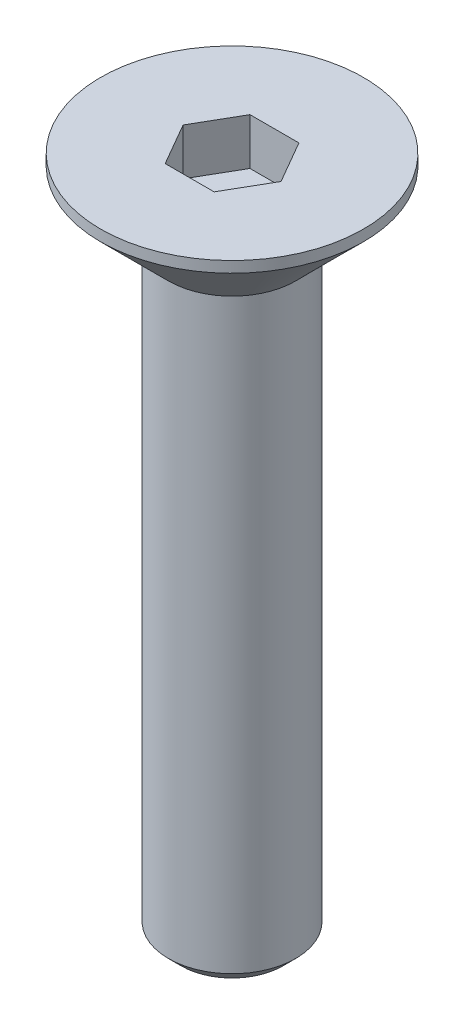
ISO-10303-21;
HEADER;
FILE_DESCRIPTION(('STEP AP214'),'2;1');
FILE_NAME('part.step','',(''),(''),'','','');
FILE_SCHEMA(('AUTOMOTIVE_DESIGN { 1 0 10303 214 1 1 1 1 }'));
ENDSEC;
DATA;
#1=APPLICATION_CONTEXT('core data for automotive mechanical design processes');
#2=APPLICATION_PROTOCOL_DEFINITION('international standard','automotive_design',2000,#1);
#3=PRODUCT_CONTEXT('',#1,'mechanical');
#4=PRODUCT('Part','Part','',(#3));
#5=PRODUCT_RELATED_PRODUCT_CATEGORY('part','',(#4));
#6=PRODUCT_DEFINITION_FORMATION('','',#4);
#7=PRODUCT_DEFINITION_CONTEXT('part definition',#1,'design');
#8=PRODUCT_DEFINITION('design','',#6,#7);
#9=PRODUCT_DEFINITION_SHAPE('','',#8);
#10=(LENGTH_UNIT() NAMED_UNIT(*) SI_UNIT(.MILLI.,.METRE.));
#11=(NAMED_UNIT(*) PLANE_ANGLE_UNIT() SI_UNIT($,.RADIAN.));
#12=(NAMED_UNIT(*) SI_UNIT($,.STERADIAN.) SOLID_ANGLE_UNIT());
#13=UNCERTAINTY_MEASURE_WITH_UNIT(LENGTH_MEASURE(1.E-05),#10,'distance_accuracy_value','');
#14=(GEOMETRIC_REPRESENTATION_CONTEXT(3) GLOBAL_UNCERTAINTY_ASSIGNED_CONTEXT((#13)) GLOBAL_UNIT_ASSIGNED_CONTEXT((#10,
#11,#12)) REPRESENTATION_CONTEXT('',''));
#15=CARTESIAN_POINT('',(0.,0.,0.));
#16=DIRECTION('',(0.,0.,1.));
#17=DIRECTION('',(1.,0.,0.));
#18=AXIS2_PLACEMENT_3D('',#15,#16,#17);
#19=CARTESIAN_POINT('',(0.,0.,0.));
#20=DIRECTION('',(0.,1.,0.));
#21=DIRECTION('',(0.,0.,1.));
#22=AXIS2_PLACEMENT_3D('',#19,#20,#21);
#23=PLANE('',#22);
#24=DIRECTION('',(-0.5,0.,0.866025403784439));
#25=VECTOR('',#24,1.);
#26=CARTESIAN_POINT('',(-0.577350269189626,0.,-1.));
#27=LINE('',#26,#25);
#28=CARTESIAN_POINT('',(-0.577350269189626,0.,-1.));
#29=VERTEX_POINT('',#28);
#30=CARTESIAN_POINT('',(-1.15470053837925,0.,0.));
#31=VERTEX_POINT('',#30);
#32=EDGE_CURVE('E53',#29,#31,#27,.T.);
#33=ORIENTED_EDGE('',*,*,#32,.F.);
#34=DIRECTION('',(-1.,0.,0.));
#35=VECTOR('',#34,1.);
#36=CARTESIAN_POINT('',(0.577350269189625,0.,-1.));
#37=LINE('',#36,#35);
#38=CARTESIAN_POINT('',(0.577350269189625,0.,-1.));
#39=VERTEX_POINT('',#38);
#40=EDGE_CURVE('E137',#39,#29,#37,.T.);
#41=ORIENTED_EDGE('',*,*,#40,.F.);
#42=DIRECTION('',(-0.5,0.,-0.866025403784438));
#43=VECTOR('',#42,1.);
#44=CARTESIAN_POINT('',(1.15470053837925,0.,0.));
#45=LINE('',#44,#43);
#46=CARTESIAN_POINT('',(1.15470053837925,0.,0.));
#47=VERTEX_POINT('',#46);
#48=EDGE_CURVE('E135',#47,#39,#45,.T.);
#49=ORIENTED_EDGE('',*,*,#48,.F.);
#50=DIRECTION('',(0.5,0.,-0.866025403784439));
#51=VECTOR('',#50,1.);
#52=CARTESIAN_POINT('',(0.577350269189626,0.,1.));
#53=LINE('',#52,#51);
#54=CARTESIAN_POINT('',(0.577350269189626,0.,1.));
#55=VERTEX_POINT('',#54);
#56=EDGE_CURVE('E101',#55,#47,#53,.T.);
#57=ORIENTED_EDGE('',*,*,#56,.F.);
#58=DIRECTION('',(1.,0.,0.));
#59=VECTOR('',#58,1.);
#60=CARTESIAN_POINT('',(-0.577350269189625,0.,1.));
#61=LINE('',#60,#59);
#62=CARTESIAN_POINT('',(-0.577350269189625,0.,1.));
#63=VERTEX_POINT('',#62);
#64=EDGE_CURVE('E131',#63,#55,#61,.T.);
#65=ORIENTED_EDGE('',*,*,#64,.F.);
#66=DIRECTION('',(0.5,0.,0.866025403784438));
#67=VECTOR('',#66,1.);
#68=CARTESIAN_POINT('',(-1.15470053837925,0.,0.));
#69=LINE('',#68,#67);
#70=EDGE_CURVE('E127',#31,#63,#69,.T.);
#71=ORIENTED_EDGE('',*,*,#70,.F.);
#72=EDGE_LOOP('',(#33,#41,#49,#57,#65,#71));
#73=FACE_BOUND('',#72,.T.);
#74=CARTESIAN_POINT('',(0.,0.,0.));
#75=DIRECTION('',(0.,1.,0.));
#76=DIRECTION('',(0.,0.,1.));
#77=AXIS2_PLACEMENT_3D('',#74,#75,#76);
#78=CIRCLE('',#77,3.1);
#79=CARTESIAN_POINT('',(0.,0.,3.1));
#80=VERTEX_POINT('',#79);
#81=EDGE_CURVE('E128',#80,#80,#78,.T.);
#82=ORIENTED_EDGE('',*,*,#81,.T.);
#83=EDGE_LOOP('',(#82));
#84=FACE_BOUND('',#83,.T.);
#85=ADVANCED_FACE('F38',(#73,#84),#23,.T.);
#86=CARTESIAN_POINT('',(-0.577350269189626,-1.1,-1.));
#87=DIRECTION('',(-0.866025403784439,0.,-0.5));
#88=DIRECTION('',(-0.5,0.,0.866025403784439));
#89=AXIS2_PLACEMENT_3D('',#86,#87,#88);
#90=PLANE('',#89);
#91=ORIENTED_EDGE('',*,*,#32,.T.);
#92=DIRECTION('',(0.,1.,0.));
#93=VECTOR('',#92,1.);
#94=CARTESIAN_POINT('',(-1.15470053837925,-1.1,0.));
#95=LINE('',#94,#93);
#96=CARTESIAN_POINT('',(-1.15470053837925,-1.1,0.));
#97=VERTEX_POINT('',#96);
#98=EDGE_CURVE('E83',#97,#31,#95,.T.);
#99=ORIENTED_EDGE('',*,*,#98,.F.);
#100=DIRECTION('',(-0.5,0.,0.866025403784439));
#101=VECTOR('',#100,1.);
#102=CARTESIAN_POINT('',(-0.577350269189626,-1.1,-1.));
#103=LINE('',#102,#101);
#104=CARTESIAN_POINT('',(-0.577350269189626,-1.1,-1.));
#105=VERTEX_POINT('',#104);
#106=EDGE_CURVE('E139',#105,#97,#103,.T.);
#107=ORIENTED_EDGE('',*,*,#106,.F.);
#108=DIRECTION('',(0.,1.,0.));
#109=VECTOR('',#108,1.);
#110=CARTESIAN_POINT('',(-0.577350269189626,-1.1,-1.));
#111=LINE('',#110,#109);
#112=EDGE_CURVE('E61',#105,#29,#111,.T.);
#113=ORIENTED_EDGE('',*,*,#112,.T.);
#114=EDGE_LOOP('',(#91,#99,#107,#113));
#115=FACE_BOUND('',#114,.T.);
#116=ADVANCED_FACE('F160',(#115),#90,.F.);
#117=CARTESIAN_POINT('',(0.577350269189625,-1.1,-1.));
#118=DIRECTION('',(0.,0.,-1.));
#119=DIRECTION('',(-1.,0.,0.));
#120=AXIS2_PLACEMENT_3D('',#117,#118,#119);
#121=PLANE('',#120);
#122=ORIENTED_EDGE('',*,*,#40,.T.);
#123=ORIENTED_EDGE('',*,*,#112,.F.);
#124=DIRECTION('',(-1.,0.,0.));
#125=VECTOR('',#124,1.);
#126=CARTESIAN_POINT('',(0.577350269189625,-1.1,-1.));
#127=LINE('',#126,#125);
#128=CARTESIAN_POINT('',(0.577350269189625,-1.1,-1.));
#129=VERTEX_POINT('',#128);
#130=EDGE_CURVE('E113',#129,#105,#127,.T.);
#131=ORIENTED_EDGE('',*,*,#130,.F.);
#132=DIRECTION('',(0.,1.,0.));
#133=VECTOR('',#132,1.);
#134=CARTESIAN_POINT('',(0.577350269189625,-1.1,-1.));
#135=LINE('',#134,#133);
#136=EDGE_CURVE('E105',#129,#39,#135,.T.);
#137=ORIENTED_EDGE('',*,*,#136,.T.);
#138=EDGE_LOOP('',(#122,#123,#131,#137));
#139=FACE_BOUND('',#138,.T.);
#140=ADVANCED_FACE('F165',(#139),#121,.F.);
#141=CARTESIAN_POINT('',(1.15470053837925,-1.1,0.));
#142=DIRECTION('',(0.866025403784439,0.,-0.5));
#143=DIRECTION('',(-0.5,0.,-0.866025403784438));
#144=AXIS2_PLACEMENT_3D('',#141,#142,#143);
#145=PLANE('',#144);
#146=ORIENTED_EDGE('',*,*,#48,.T.);
#147=ORIENTED_EDGE('',*,*,#136,.F.);
#148=DIRECTION('',(-0.5,0.,-0.866025403784438));
#149=VECTOR('',#148,1.);
#150=CARTESIAN_POINT('',(1.15470053837925,-1.1,0.));
#151=LINE('',#150,#149);
#152=CARTESIAN_POINT('',(1.15470053837925,-1.1,0.));
#153=VERTEX_POINT('',#152);
#154=EDGE_CURVE('E109',#153,#129,#151,.T.);
#155=ORIENTED_EDGE('',*,*,#154,.F.);
#156=DIRECTION('',(0.,1.,0.));
#157=VECTOR('',#156,1.);
#158=CARTESIAN_POINT('',(1.15470053837925,-1.1,0.));
#159=LINE('',#158,#157);
#160=EDGE_CURVE('E94',#153,#47,#159,.T.);
#161=ORIENTED_EDGE('',*,*,#160,.T.);
#162=EDGE_LOOP('',(#146,#147,#155,#161));
#163=FACE_BOUND('',#162,.T.);
#164=ADVANCED_FACE('F110',(#163),#145,.F.);
#165=CARTESIAN_POINT('',(0.577350269189626,-1.1,1.));
#166=DIRECTION('',(0.866025403784439,0.,0.5));
#167=DIRECTION('',(0.5,0.,-0.866025403784439));
#168=AXIS2_PLACEMENT_3D('',#165,#166,#167);
#169=PLANE('',#168);
#170=ORIENTED_EDGE('',*,*,#56,.T.);
#171=ORIENTED_EDGE('',*,*,#160,.F.);
#172=DIRECTION('',(0.5,0.,-0.866025403784439));
#173=VECTOR('',#172,1.);
#174=CARTESIAN_POINT('',(0.577350269189626,-1.1,1.));
#175=LINE('',#174,#173);
#176=CARTESIAN_POINT('',(0.577350269189626,-1.1,1.));
#177=VERTEX_POINT('',#176);
#178=EDGE_CURVE('E98',#177,#153,#175,.T.);
#179=ORIENTED_EDGE('',*,*,#178,.F.);
#180=DIRECTION('',(0.,1.,0.));
#181=VECTOR('',#180,1.);
#182=CARTESIAN_POINT('',(0.577350269189626,-1.1,1.));
#183=LINE('',#182,#181);
#184=EDGE_CURVE('E106',#177,#55,#183,.T.);
#185=ORIENTED_EDGE('',*,*,#184,.T.);
#186=EDGE_LOOP('',(#170,#171,#179,#185));
#187=FACE_BOUND('',#186,.T.);
#188=ADVANCED_FACE('F96',(#187),#169,.F.);
#189=CARTESIAN_POINT('',(-0.577350269189625,-1.1,1.));
#190=DIRECTION('',(0.,0.,1.));
#191=DIRECTION('',(1.,0.,0.));
#192=AXIS2_PLACEMENT_3D('',#189,#190,#191);
#193=PLANE('',#192);
#194=ORIENTED_EDGE('',*,*,#64,.T.);
#195=ORIENTED_EDGE('',*,*,#184,.F.);
#196=DIRECTION('',(1.,0.,0.));
#197=VECTOR('',#196,1.);
#198=CARTESIAN_POINT('',(-0.577350269189625,-1.1,1.));
#199=LINE('',#198,#197);
#200=CARTESIAN_POINT('',(-0.577350269189625,-1.1,1.));
#201=VERTEX_POINT('',#200);
#202=EDGE_CURVE('E119',#201,#177,#199,.T.);
#203=ORIENTED_EDGE('',*,*,#202,.F.);
#204=DIRECTION('',(0.,1.,0.));
#205=VECTOR('',#204,1.);
#206=CARTESIAN_POINT('',(-0.577350269189625,-1.1,1.));
#207=LINE('',#206,#205);
#208=EDGE_CURVE('E143',#201,#63,#207,.T.);
#209=ORIENTED_EDGE('',*,*,#208,.T.);
#210=EDGE_LOOP('',(#194,#195,#203,#209));
#211=FACE_BOUND('',#210,.T.);
#212=ADVANCED_FACE('F172',(#211),#193,.F.);
#213=CARTESIAN_POINT('',(-1.15470053837925,-1.1,0.));
#214=DIRECTION('',(-0.866025403784438,0.,0.5));
#215=DIRECTION('',(0.5,0.,0.866025403784439));
#216=AXIS2_PLACEMENT_3D('',#213,#214,#215);
#217=PLANE('',#216);
#218=ORIENTED_EDGE('',*,*,#70,.T.);
#219=ORIENTED_EDGE('',*,*,#208,.F.);
#220=DIRECTION('',(0.5,0.,0.866025403784438));
#221=VECTOR('',#220,1.);
#222=CARTESIAN_POINT('',(-1.15470053837925,-1.1,0.));
#223=LINE('',#222,#221);
#224=EDGE_CURVE('E121',#97,#201,#223,.T.);
#225=ORIENTED_EDGE('',*,*,#224,.F.);
#226=ORIENTED_EDGE('',*,*,#98,.T.);
#227=EDGE_LOOP('',(#218,#219,#225,#226));
#228=FACE_BOUND('',#227,.T.);
#229=ADVANCED_FACE('F169',(#228),#217,.F.);
#230=CARTESIAN_POINT('',(0.,-1.1,0.));
#231=DIRECTION('',(0.,1.,0.));
#232=DIRECTION('',(0.,0.,1.));
#233=AXIS2_PLACEMENT_3D('',#230,#231,#232);
#234=PLANE('',#233);
#235=ORIENTED_EDGE('',*,*,#106,.T.);
#236=ORIENTED_EDGE('',*,*,#224,.T.);
#237=ORIENTED_EDGE('',*,*,#202,.T.);
#238=ORIENTED_EDGE('',*,*,#178,.T.);
#239=ORIENTED_EDGE('',*,*,#154,.T.);
#240=ORIENTED_EDGE('',*,*,#130,.T.);
#241=EDGE_LOOP('',(#235,#236,#237,#238,#239,#240));
#242=FACE_BOUND('',#241,.T.);
#243=ADVANCED_FACE('F116',(#242),#234,.T.);
#244=CARTESIAN_POINT('',(0.,0.,0.));
#245=DIRECTION('',(0.,1.,0.));
#246=DIRECTION('',(0.,0.,1.));
#247=AXIS2_PLACEMENT_3D('',#244,#245,#246);
#248=CYLINDRICAL_SURFACE('',#247,3.1);
#249=ORIENTED_EDGE('',*,*,#81,.F.);
#250=EDGE_LOOP('',(#249));
#251=FACE_BOUND('',#250,.T.);
#252=CARTESIAN_POINT('',(0.,-0.260000000000026,0.));
#253=DIRECTION('',(0.,1.,0.));
#254=DIRECTION('',(0.,0.,1.));
#255=AXIS2_PLACEMENT_3D('',#252,#253,#254);
#256=CIRCLE('',#255,3.1);
#257=CARTESIAN_POINT('',(0.,-0.260000000000026,3.1));
#258=VERTEX_POINT('',#257);
#259=EDGE_CURVE('E199',#258,#258,#256,.T.);
#260=ORIENTED_EDGE('',*,*,#259,.T.);
#261=EDGE_LOOP('',(#260));
#262=FACE_BOUND('',#261,.T.);
#263=ADVANCED_FACE('F184',(#251,#262),#248,.T.);
#264=CARTESIAN_POINT('',(0.,-1.86000000000001,0.));
#265=DIRECTION('',(0.,1.,0.));
#266=DIRECTION('',(0.,0.,1.));
#267=AXIS2_PLACEMENT_3D('',#264,#265,#266);
#268=CONICAL_SURFACE('',#267,1.5,0.785398163397454);
#269=ORIENTED_EDGE('',*,*,#259,.F.);
#270=EDGE_LOOP('',(#269));
#271=FACE_BOUND('',#270,.T.);
#272=CARTESIAN_POINT('',(0.,-1.86000000000001,0.));
#273=DIRECTION('',(0.,1.,0.));
#274=DIRECTION('',(0.,0.,1.));
#275=AXIS2_PLACEMENT_3D('',#272,#273,#274);
#276=CIRCLE('',#275,1.5);
#277=CARTESIAN_POINT('',(0.,-1.86000000000001,1.5));
#278=VERTEX_POINT('',#277);
#279=EDGE_CURVE('E202',#278,#278,#276,.T.);
#280=ORIENTED_EDGE('',*,*,#279,.T.);
#281=EDGE_LOOP('',(#280));
#282=FACE_BOUND('',#281,.T.);
#283=ADVANCED_FACE('F188',(#271,#282),#268,.T.);
#284=CARTESIAN_POINT('',(0.,-16.,0.));
#285=DIRECTION('',(0.,-1.,0.));
#286=DIRECTION('',(0.,0.,-1.));
#287=AXIS2_PLACEMENT_3D('',#284,#285,#286);
#288=PLANE('',#287);
#289=CARTESIAN_POINT('',(0.,-16.,0.));
#290=DIRECTION('',(0.,-1.,0.));
#291=DIRECTION('',(0.,0.,-1.));
#292=AXIS2_PLACEMENT_3D('',#289,#290,#291);
#293=CIRCLE('',#292,1.20000000000001);
#294=CARTESIAN_POINT('',(0.,-16.,-1.20000000000001));
#295=VERTEX_POINT('',#294);
#296=EDGE_CURVE('E46',#295,#295,#293,.T.);
#297=ORIENTED_EDGE('',*,*,#296,.T.);
#298=EDGE_LOOP('',(#297));
#299=FACE_BOUND('',#298,.T.);
#300=ADVANCED_FACE('F148',(#299),#288,.T.);
#301=CARTESIAN_POINT('',(0.,-16.,0.));
#302=DIRECTION('',(0.,1.,0.));
#303=DIRECTION('',(0.,0.,1.));
#304=AXIS2_PLACEMENT_3D('',#301,#302,#303);
#305=CYLINDRICAL_SURFACE('',#304,1.5);
#306=CARTESIAN_POINT('',(0.,-15.7,0.));
#307=DIRECTION('',(0.,-1.,0.));
#308=DIRECTION('',(0.,0.,-1.));
#309=AXIS2_PLACEMENT_3D('',#306,#307,#308);
#310=CIRCLE('',#309,1.5);
#311=CARTESIAN_POINT('',(0.,-15.7,1.5));
#312=VERTEX_POINT('',#311);
#313=EDGE_CURVE('E11',#312,#312,#310,.F.);
#314=CARTESIAN_POINT('',(0.,-15.7,1.5));
#315=CARTESIAN_POINT('',(0.,-15.5558333333333,1.5));
#316=CARTESIAN_POINT('',(0.,-15.4116666666667,1.5));
#317=CARTESIAN_POINT('',(0.,-15.1233333333333,1.5));
#318=CARTESIAN_POINT('',(0.,-14.9791666666667,1.5));
#319=CARTESIAN_POINT('',(0.,-14.6908333333333,1.5));
#320=CARTESIAN_POINT('',(0.,-14.5466666666667,1.5));
#321=CARTESIAN_POINT('',(0.,-14.2583333333333,1.5));
#322=CARTESIAN_POINT('',(0.,-14.1141666666667,1.5));
#323=CARTESIAN_POINT('',(0.,-13.8258333333333,1.5));
#324=CARTESIAN_POINT('',(0.,-13.6816666666667,1.5));
#325=CARTESIAN_POINT('',(0.,-13.3933333333333,1.5));
#326=CARTESIAN_POINT('',(0.,-13.2491666666667,1.5));
#327=CARTESIAN_POINT('',(0.,-12.9608333333333,1.5));
#328=CARTESIAN_POINT('',(0.,-12.8166666666667,1.5));
#329=CARTESIAN_POINT('',(0.,-12.5283333333333,1.5));
#330=CARTESIAN_POINT('',(0.,-12.3841666666667,1.5));
#331=CARTESIAN_POINT('',(0.,-12.0958333333333,1.5));
#332=CARTESIAN_POINT('',(0.,-11.9516666666667,1.5));
#333=CARTESIAN_POINT('',(0.,-11.6633333333333,1.5));
#334=CARTESIAN_POINT('',(0.,-11.5191666666667,1.5));
#335=CARTESIAN_POINT('',(0.,-11.2308333333333,1.5));
#336=CARTESIAN_POINT('',(0.,-11.0866666666667,1.5));
#337=CARTESIAN_POINT('',(0.,-10.7983333333333,1.5));
#338=CARTESIAN_POINT('',(0.,-10.6541666666667,1.5));
#339=CARTESIAN_POINT('',(0.,-10.3658333333333,1.5));
#340=CARTESIAN_POINT('',(0.,-10.2216666666667,1.5));
#341=CARTESIAN_POINT('',(0.,-9.93333333333334,1.5));
#342=CARTESIAN_POINT('',(0.,-9.78916666666667,1.5));
#343=CARTESIAN_POINT('',(0.,-9.50083333333334,1.5));
#344=CARTESIAN_POINT('',(0.,-9.35666666666667,1.5));
#345=CARTESIAN_POINT('',(0.,-9.06833333333334,1.5));
#346=CARTESIAN_POINT('',(0.,-8.92416666666667,1.5));
#347=CARTESIAN_POINT('',(0.,-8.63583333333334,1.5));
#348=CARTESIAN_POINT('',(0.,-8.49166666666667,1.5));
#349=CARTESIAN_POINT('',(0.,-8.20333333333334,1.5));
#350=CARTESIAN_POINT('',(0.,-8.05916666666668,1.5));
#351=CARTESIAN_POINT('',(0.,-7.77083333333334,1.5));
#352=CARTESIAN_POINT('',(0.,-7.62666666666667,1.5));
#353=CARTESIAN_POINT('',(0.,-7.33833333333334,1.5));
#354=CARTESIAN_POINT('',(0.,-7.19416666666667,1.5));
#355=CARTESIAN_POINT('',(0.,-6.90583333333334,1.5));
#356=CARTESIAN_POINT('',(0.,-6.76166666666668,1.5));
#357=CARTESIAN_POINT('',(0.,-6.47333333333334,1.5));
#358=CARTESIAN_POINT('',(0.,-6.32916666666667,1.5));
#359=CARTESIAN_POINT('',(0.,-6.04083333333334,1.5));
#360=CARTESIAN_POINT('',(0.,-5.89666666666667,1.5));
#361=CARTESIAN_POINT('',(0.,-5.60833333333334,1.5));
#362=CARTESIAN_POINT('',(0.,-5.46416666666668,1.5));
#363=CARTESIAN_POINT('',(0.,-5.17583333333334,1.5));
#364=CARTESIAN_POINT('',(0.,-5.03166666666668,1.5));
#365=CARTESIAN_POINT('',(0.,-4.74333333333334,1.5));
#366=CARTESIAN_POINT('',(0.,-4.59916666666668,1.5));
#367=CARTESIAN_POINT('',(0.,-4.31083333333334,1.5));
#368=CARTESIAN_POINT('',(0.,-4.16666666666667,1.5));
#369=CARTESIAN_POINT('',(0.,-3.87833333333334,1.5));
#370=CARTESIAN_POINT('',(0.,-3.73416666666668,1.5));
#371=CARTESIAN_POINT('',(0.,-3.44583333333334,1.5));
#372=CARTESIAN_POINT('',(0.,-3.30166666666668,1.5));
#373=CARTESIAN_POINT('',(0.,-3.01333333333334,1.5));
#374=CARTESIAN_POINT('',(0.,-2.86916666666668,1.5));
#375=CARTESIAN_POINT('',(0.,-2.58083333333334,1.5));
#376=CARTESIAN_POINT('',(0.,-2.43666666666668,1.5));
#377=CARTESIAN_POINT('',(0.,-2.14833333333334,1.5));
#378=CARTESIAN_POINT('',(0.,-2.00416666666668,1.5));
#379=CARTESIAN_POINT('',(0.,-1.86000000000001,1.5));
#380=B_SPLINE_CURVE_WITH_KNOTS('',3,(#314,#315,#316,#317,#318,#319,#320,#321,#322,#323,#324,
#325,#326,#327,#328,#329,#330,#331,#332,#333,#334,#335,#336,#337,#338,#339,#340,#341,#342,#343,
#344,#345,#346,#347,#348,#349,#350,#351,#352,#353,#354,#355,#356,#357,#358,#359,#360,#361,#362,
#363,#364,#365,#366,#367,#368,#369,#370,#371,#372,#373,#374,#375,#376,#377,#378,#379),
.UNSPECIFIED.,.F.,.F.,(4,2,2,2,2,2,2,2,2,2,2,2,2,2,2,2,2,2,2,2,2,2,2,2,2,2,2,2,2,2,2,2,4),(0.,
0.432499999999999,0.864999999999998,1.2975,1.73,2.1625,2.595,3.0275,3.46,3.8925,4.325,4.7575,
5.19,5.6225,6.055,6.4875,6.92,7.35249999999999,7.78499999999999,8.21749999999999,8.65,
9.08249999999999,9.51499999999999,9.94749999999999,10.38,10.8125,11.245,11.6775,12.11,12.5425,
12.975,13.4075,13.84),.UNSPECIFIED.);
#381=EDGE_CURVE('BSEAM151',#312,#278,#380,.T.);
#382=ORIENTED_EDGE('',*,*,#313,.T.);
#383=ORIENTED_EDGE('',*,*,#279,.F.);
#384=ORIENTED_EDGE('',*,*,#381,.T.);
#385=ORIENTED_EDGE('',*,*,#381,.F.);
#386=EDGE_LOOP('',(#382,#384,#383,#385));
#387=FACE_BOUND('',#386,.T.);
#388=ADVANCED_FACE('F151',(#387),#305,.T.);
#389=CARTESIAN_POINT('',(0.,-16.,0.));
#390=DIRECTION('',(0.,1.,0.));
#391=DIRECTION('',(0.,0.,1.));
#392=AXIS2_PLACEMENT_3D('',#389,#390,#391);
#393=CONICAL_SURFACE('',#392,1.20000000000001,0.785398163397447);
#394=ORIENTED_EDGE('',*,*,#313,.F.);
#395=EDGE_LOOP('',(#394));
#396=FACE_BOUND('',#395,.T.);
#397=ORIENTED_EDGE('',*,*,#296,.F.);
#398=EDGE_LOOP('',(#397));
#399=FACE_BOUND('',#398,.T.);
#400=ADVANCED_FACE('F40',(#396,#399),#393,.T.);
#401=CLOSED_SHELL('',(#85,#116,#140,#164,#188,#212,#229,#243,#263,#283,#300,#388,#400));
#402=MANIFOLD_SOLID_BREP('B2',#401);
#403=ADVANCED_BREP_SHAPE_REPRESENTATION('',(#18,#402),#14);
#404=SHAPE_DEFINITION_REPRESENTATION(#9,#403);
ENDSEC;
END-ISO-10303-21;
